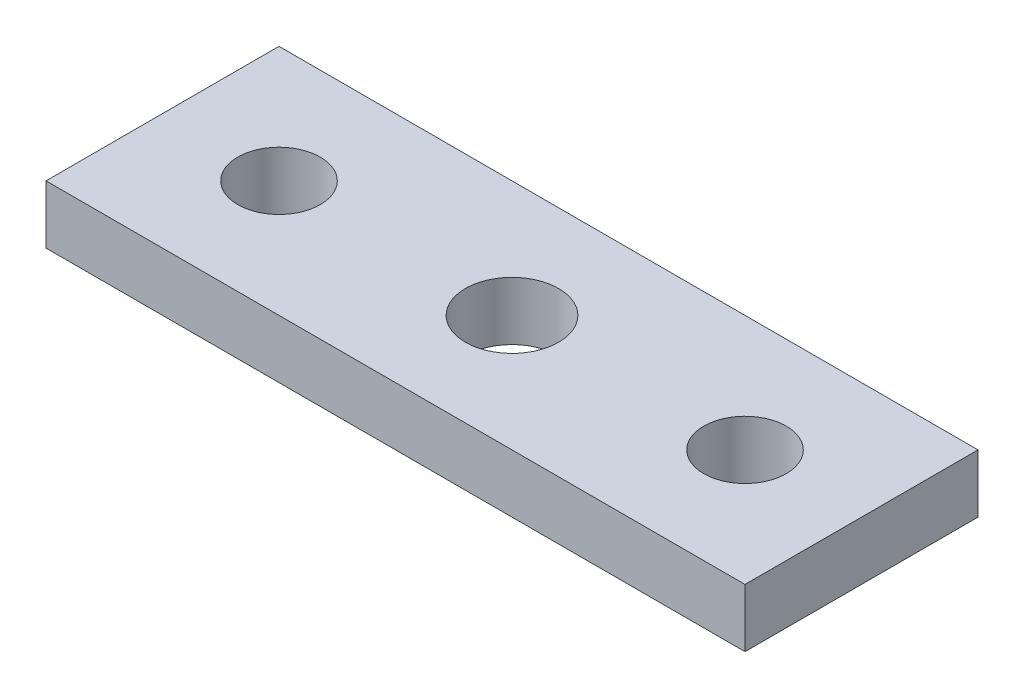
ISO-10303-21;
HEADER;
FILE_DESCRIPTION(('STEP AP214'),'2;1');
FILE_NAME('part.step','',(''),(''),'','','');
FILE_SCHEMA(('AUTOMOTIVE_DESIGN { 1 0 10303 214 1 1 1 1 }'));
ENDSEC;
DATA;
#1=APPLICATION_CONTEXT('core data for automotive mechanical design processes');
#2=APPLICATION_PROTOCOL_DEFINITION('international standard','automotive_design',2000,#1);
#3=PRODUCT_CONTEXT('',#1,'mechanical');
#4=PRODUCT('Part','Part','',(#3));
#5=PRODUCT_RELATED_PRODUCT_CATEGORY('part','',(#4));
#6=PRODUCT_DEFINITION_FORMATION('','',#4);
#7=PRODUCT_DEFINITION_CONTEXT('part definition',#1,'design');
#8=PRODUCT_DEFINITION('design','',#6,#7);
#9=PRODUCT_DEFINITION_SHAPE('','',#8);
#10=(LENGTH_UNIT() NAMED_UNIT(*) SI_UNIT(.MILLI.,.METRE.));
#11=(NAMED_UNIT(*) PLANE_ANGLE_UNIT() SI_UNIT($,.RADIAN.));
#12=(NAMED_UNIT(*) SI_UNIT($,.STERADIAN.) SOLID_ANGLE_UNIT());
#13=UNCERTAINTY_MEASURE_WITH_UNIT(LENGTH_MEASURE(1.E-05),#10,'distance_accuracy_value','');
#14=(GEOMETRIC_REPRESENTATION_CONTEXT(3) GLOBAL_UNCERTAINTY_ASSIGNED_CONTEXT((#13)) GLOBAL_UNIT_ASSIGNED_CONTEXT((#10,
#11,#12)) REPRESENTATION_CONTEXT('',''));
#15=CARTESIAN_POINT('',(0.,0.,0.));
#16=DIRECTION('',(0.,0.,1.));
#17=DIRECTION('',(1.,0.,0.));
#18=AXIS2_PLACEMENT_3D('',#15,#16,#17);
#19=CARTESIAN_POINT('',(-19.05,3.175,-6.35));
#20=DIRECTION('',(1.,0.,0.));
#21=DIRECTION('',(0.,0.,-1.));
#22=AXIS2_PLACEMENT_3D('',#19,#20,#21);
#23=PLANE('',#22);
#24=DIRECTION('',(0.,0.,1.));
#25=VECTOR('',#24,1.);
#26=CARTESIAN_POINT('',(-19.05,0.,-6.35));
#27=LINE('',#26,#25);
#28=CARTESIAN_POINT('',(-19.05,0.,-6.35));
#29=VERTEX_POINT('',#28);
#30=CARTESIAN_POINT('',(-19.05,0.,6.35));
#31=VERTEX_POINT('',#30);
#32=EDGE_CURVE('E98',#29,#31,#27,.T.);
#33=ORIENTED_EDGE('',*,*,#32,.T.);
#34=DIRECTION('',(0.,-1.,0.));
#35=VECTOR('',#34,1.);
#36=CARTESIAN_POINT('',(-19.05,3.175,6.35));
#37=LINE('',#36,#35);
#38=CARTESIAN_POINT('',(-19.05,3.175,6.35));
#39=VERTEX_POINT('',#38);
#40=EDGE_CURVE('E11',#39,#31,#37,.T.);
#41=ORIENTED_EDGE('',*,*,#40,.F.);
#42=DIRECTION('',(0.,0.,1.));
#43=VECTOR('',#42,1.);
#44=CARTESIAN_POINT('',(-19.05,3.175,-6.35));
#45=LINE('',#44,#43);
#46=CARTESIAN_POINT('',(-19.05,3.175,-6.35));
#47=VERTEX_POINT('',#46);
#48=EDGE_CURVE('E86',#47,#39,#45,.T.);
#49=ORIENTED_EDGE('',*,*,#48,.F.);
#50=DIRECTION('',(0.,-1.,0.));
#51=VECTOR('',#50,1.);
#52=CARTESIAN_POINT('',(-19.05,3.175,-6.35));
#53=LINE('',#52,#51);
#54=EDGE_CURVE('E94',#47,#29,#53,.T.);
#55=ORIENTED_EDGE('',*,*,#54,.T.);
#56=EDGE_LOOP('',(#33,#41,#49,#55));
#57=FACE_BOUND('',#56,.T.);
#58=ADVANCED_FACE('F35',(#57),#23,.F.);
#59=CARTESIAN_POINT('',(-19.05,3.175,6.35));
#60=DIRECTION('',(0.,0.,-1.));
#61=DIRECTION('',(-1.,0.,0.));
#62=AXIS2_PLACEMENT_3D('',#59,#60,#61);
#63=PLANE('',#62);
#64=DIRECTION('',(1.,0.,0.));
#65=VECTOR('',#64,1.);
#66=CARTESIAN_POINT('',(-19.05,0.,6.35));
#67=LINE('',#66,#65);
#68=CARTESIAN_POINT('',(19.05,0.,6.35));
#69=VERTEX_POINT('',#68);
#70=EDGE_CURVE('E90',#31,#69,#67,.T.);
#71=ORIENTED_EDGE('',*,*,#70,.T.);
#72=DIRECTION('',(0.,-1.,0.));
#73=VECTOR('',#72,1.);
#74=CARTESIAN_POINT('',(19.05,3.175,6.35));
#75=LINE('',#74,#73);
#76=CARTESIAN_POINT('',(19.05,3.175,6.35));
#77=VERTEX_POINT('',#76);
#78=EDGE_CURVE('E43',#77,#69,#75,.T.);
#79=ORIENTED_EDGE('',*,*,#78,.F.);
#80=DIRECTION('',(1.,0.,0.));
#81=VECTOR('',#80,1.);
#82=CARTESIAN_POINT('',(-19.05,3.175,6.35));
#83=LINE('',#82,#81);
#84=EDGE_CURVE('E81',#39,#77,#83,.T.);
#85=ORIENTED_EDGE('',*,*,#84,.F.);
#86=ORIENTED_EDGE('',*,*,#40,.T.);
#87=EDGE_LOOP('',(#71,#79,#85,#86));
#88=FACE_BOUND('',#87,.T.);
#89=ADVANCED_FACE('F89',(#88),#63,.F.);
#90=CARTESIAN_POINT('',(19.05,3.175,-6.35));
#91=DIRECTION('',(-1.,0.,0.));
#92=DIRECTION('',(0.,0.,1.));
#93=AXIS2_PLACEMENT_3D('',#90,#91,#92);
#94=PLANE('',#93);
#95=DIRECTION('',(0.,0.,-1.));
#96=VECTOR('',#95,1.);
#97=CARTESIAN_POINT('',(19.05,0.,-6.35));
#98=LINE('',#97,#96);
#99=CARTESIAN_POINT('',(19.05,0.,-6.35));
#100=VERTEX_POINT('',#99);
#101=EDGE_CURVE('E68',#69,#100,#98,.T.);
#102=ORIENTED_EDGE('',*,*,#101,.T.);
#103=DIRECTION('',(0.,-1.,0.));
#104=VECTOR('',#103,1.);
#105=CARTESIAN_POINT('',(19.05,3.175,-6.35));
#106=LINE('',#105,#104);
#107=CARTESIAN_POINT('',(19.05,3.175,-6.35));
#108=VERTEX_POINT('',#107);
#109=EDGE_CURVE('E91',#108,#100,#106,.T.);
#110=ORIENTED_EDGE('',*,*,#109,.F.);
#111=DIRECTION('',(0.,0.,-1.));
#112=VECTOR('',#111,1.);
#113=CARTESIAN_POINT('',(19.05,3.175,-6.35));
#114=LINE('',#113,#112);
#115=EDGE_CURVE('E84',#77,#108,#114,.T.);
#116=ORIENTED_EDGE('',*,*,#115,.F.);
#117=ORIENTED_EDGE('',*,*,#78,.T.);
#118=EDGE_LOOP('',(#102,#110,#116,#117));
#119=FACE_BOUND('',#118,.T.);
#120=ADVANCED_FACE('F92',(#119),#94,.F.);
#121=CARTESIAN_POINT('',(-19.05,3.175,-6.35));
#122=DIRECTION('',(0.,0.,1.));
#123=DIRECTION('',(1.,0.,0.));
#124=AXIS2_PLACEMENT_3D('',#121,#122,#123);
#125=PLANE('',#124);
#126=DIRECTION('',(-1.,0.,0.));
#127=VECTOR('',#126,1.);
#128=CARTESIAN_POINT('',(-19.05,0.,-6.35));
#129=LINE('',#128,#127);
#130=EDGE_CURVE('E74',#100,#29,#129,.T.);
#131=ORIENTED_EDGE('',*,*,#130,.T.);
#132=ORIENTED_EDGE('',*,*,#54,.F.);
#133=DIRECTION('',(-1.,0.,0.));
#134=VECTOR('',#133,1.);
#135=CARTESIAN_POINT('',(-19.05,3.175,-6.35));
#136=LINE('',#135,#134);
#137=EDGE_CURVE('E51',#108,#47,#136,.T.);
#138=ORIENTED_EDGE('',*,*,#137,.F.);
#139=ORIENTED_EDGE('',*,*,#109,.T.);
#140=EDGE_LOOP('',(#131,#132,#138,#139));
#141=FACE_BOUND('',#140,.T.);
#142=ADVANCED_FACE('F106',(#141),#125,.F.);
#143=CARTESIAN_POINT('',(0.,3.175,0.));
#144=DIRECTION('',(0.,1.,0.));
#145=DIRECTION('',(0.,0.,1.));
#146=AXIS2_PLACEMENT_3D('',#143,#144,#145);
#147=PLANE('',#146);
#148=CARTESIAN_POINT('',(-12.7,3.175,0.));
#149=DIRECTION('',(0.,1.,0.));
#150=DIRECTION('',(0.,0.,1.));
#151=AXIS2_PLACEMENT_3D('',#148,#149,#150);
#152=CIRCLE('',#151,2.24789999999999);
#153=CARTESIAN_POINT('',(-12.7,3.175,2.24789999999999));
#154=VERTEX_POINT('',#153);
#155=EDGE_CURVE('E126',#154,#154,#152,.T.);
#156=ORIENTED_EDGE('',*,*,#155,.F.);
#157=EDGE_LOOP('',(#156));
#158=FACE_BOUND('',#157,.T.);
#159=CARTESIAN_POINT('',(12.7,3.175,0.));
#160=DIRECTION('',(0.,1.,0.));
#161=DIRECTION('',(0.,0.,1.));
#162=AXIS2_PLACEMENT_3D('',#159,#160,#161);
#163=CIRCLE('',#162,2.24789999999999);
#164=CARTESIAN_POINT('',(12.7,3.175,2.24789999999999));
#165=VERTEX_POINT('',#164);
#166=EDGE_CURVE('E120',#165,#165,#163,.T.);
#167=ORIENTED_EDGE('',*,*,#166,.F.);
#168=EDGE_LOOP('',(#167));
#169=FACE_BOUND('',#168,.T.);
#170=CARTESIAN_POINT('',(0.,3.175,0.));
#171=DIRECTION('',(0.,1.,0.));
#172=DIRECTION('',(0.,0.,1.));
#173=AXIS2_PLACEMENT_3D('',#170,#171,#172);
#174=CIRCLE('',#173,2.54);
#175=CARTESIAN_POINT('',(0.,3.175,2.54));
#176=VERTEX_POINT('',#175);
#177=EDGE_CURVE('E112',#176,#176,#174,.T.);
#178=ORIENTED_EDGE('',*,*,#177,.F.);
#179=EDGE_LOOP('',(#178));
#180=FACE_BOUND('',#179,.T.);
#181=ORIENTED_EDGE('',*,*,#48,.T.);
#182=ORIENTED_EDGE('',*,*,#84,.T.);
#183=ORIENTED_EDGE('',*,*,#115,.T.);
#184=ORIENTED_EDGE('',*,*,#137,.T.);
#185=EDGE_LOOP('',(#181,#182,#183,#184));
#186=FACE_BOUND('',#185,.T.);
#187=ADVANCED_FACE('F82',(#158,#169,#180,#186),#147,.T.);
#188=CARTESIAN_POINT('',(0.,0.,0.));
#189=DIRECTION('',(0.,1.,0.));
#190=DIRECTION('',(0.,0.,1.));
#191=AXIS2_PLACEMENT_3D('',#188,#189,#190);
#192=PLANE('',#191);
#193=CARTESIAN_POINT('',(-12.7,0.,0.));
#194=DIRECTION('',(0.,1.,0.));
#195=DIRECTION('',(0.,0.,1.));
#196=AXIS2_PLACEMENT_3D('',#193,#194,#195);
#197=CIRCLE('',#196,2.2479);
#198=CARTESIAN_POINT('',(-12.7,0.,2.2479));
#199=VERTEX_POINT('',#198);
#200=EDGE_CURVE('E123',#199,#199,#197,.T.);
#201=ORIENTED_EDGE('',*,*,#200,.T.);
#202=EDGE_LOOP('',(#201));
#203=FACE_BOUND('',#202,.T.);
#204=CARTESIAN_POINT('',(12.7,0.,0.));
#205=DIRECTION('',(0.,1.,0.));
#206=DIRECTION('',(0.,0.,1.));
#207=AXIS2_PLACEMENT_3D('',#204,#205,#206);
#208=CIRCLE('',#207,2.2479);
#209=CARTESIAN_POINT('',(12.7,0.,2.2479));
#210=VERTEX_POINT('',#209);
#211=EDGE_CURVE('E115',#210,#210,#208,.T.);
#212=ORIENTED_EDGE('',*,*,#211,.T.);
#213=EDGE_LOOP('',(#212));
#214=FACE_BOUND('',#213,.T.);
#215=CARTESIAN_POINT('',(0.,0.,0.));
#216=DIRECTION('',(0.,1.,0.));
#217=DIRECTION('',(0.,0.,1.));
#218=AXIS2_PLACEMENT_3D('',#215,#216,#217);
#219=CIRCLE('',#218,2.54);
#220=CARTESIAN_POINT('',(0.,0.,2.54));
#221=VERTEX_POINT('',#220);
#222=EDGE_CURVE('E101',#221,#221,#219,.T.);
#223=ORIENTED_EDGE('',*,*,#222,.T.);
#224=EDGE_LOOP('',(#223));
#225=FACE_BOUND('',#224,.T.);
#226=ORIENTED_EDGE('',*,*,#32,.F.);
#227=ORIENTED_EDGE('',*,*,#130,.F.);
#228=ORIENTED_EDGE('',*,*,#101,.F.);
#229=ORIENTED_EDGE('',*,*,#70,.F.);
#230=EDGE_LOOP('',(#226,#227,#228,#229));
#231=FACE_BOUND('',#230,.T.);
#232=ADVANCED_FACE('F109',(#203,#214,#225,#231),#192,.F.);
#233=CARTESIAN_POINT('',(0.,0.,0.));
#234=DIRECTION('',(0.,1.,0.));
#235=DIRECTION('',(0.,0.,1.));
#236=AXIS2_PLACEMENT_3D('',#233,#234,#235);
#237=CYLINDRICAL_SURFACE('',#236,2.54);
#238=ORIENTED_EDGE('',*,*,#222,.F.);
#239=EDGE_LOOP('',(#238));
#240=FACE_BOUND('',#239,.T.);
#241=ORIENTED_EDGE('',*,*,#177,.T.);
#242=EDGE_LOOP('',(#241));
#243=FACE_BOUND('',#242,.T.);
#244=ADVANCED_FACE('F139',(#240,#243),#237,.F.);
#245=CARTESIAN_POINT('',(12.7,3.175,0.));
#246=DIRECTION('',(0.,1.,0.));
#247=DIRECTION('',(0.,0.,1.));
#248=AXIS2_PLACEMENT_3D('',#245,#246,#247);
#249=CYLINDRICAL_SURFACE('',#248,2.24789999999999);
#250=ORIENTED_EDGE('',*,*,#211,.F.);
#251=EDGE_LOOP('',(#250));
#252=FACE_BOUND('',#251,.T.);
#253=ORIENTED_EDGE('',*,*,#166,.T.);
#254=EDGE_LOOP('',(#253));
#255=FACE_BOUND('',#254,.T.);
#256=ADVANCED_FACE('F141',(#252,#255),#249,.F.);
#257=CARTESIAN_POINT('',(-12.7,3.175,0.));
#258=DIRECTION('',(0.,1.,0.));
#259=DIRECTION('',(0.,0.,1.));
#260=AXIS2_PLACEMENT_3D('',#257,#258,#259);
#261=CYLINDRICAL_SURFACE('',#260,2.24789999999999);
#262=ORIENTED_EDGE('',*,*,#200,.F.);
#263=EDGE_LOOP('',(#262));
#264=FACE_BOUND('',#263,.T.);
#265=ORIENTED_EDGE('',*,*,#155,.T.);
#266=EDGE_LOOP('',(#265));
#267=FACE_BOUND('',#266,.T.);
#268=ADVANCED_FACE('F130',(#264,#267),#261,.F.);
#269=CLOSED_SHELL('',(#58,#89,#120,#142,#187,#232,#244,#256,#268));
#270=MANIFOLD_SOLID_BREP('B2',#269);
#271=ADVANCED_BREP_SHAPE_REPRESENTATION('',(#18,#270),#14);
#272=SHAPE_DEFINITION_REPRESENTATION(#9,#271);
ENDSEC;
END-ISO-10303-21;
